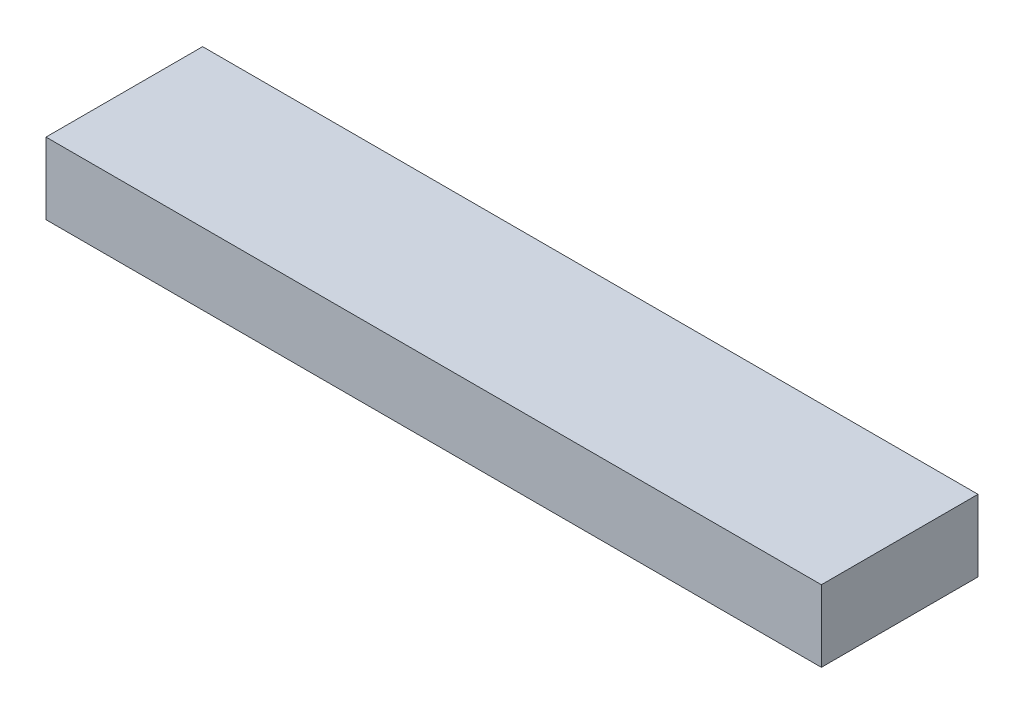
ISO-10303-21;
HEADER;
FILE_DESCRIPTION(('STEP AP214'),'2;1');
FILE_NAME('part.step','',(''),(''),'','','');
FILE_SCHEMA(('AUTOMOTIVE_DESIGN { 1 0 10303 214 1 1 1 1 }'));
ENDSEC;
DATA;
#1=APPLICATION_CONTEXT('core data for automotive mechanical design processes');
#2=APPLICATION_PROTOCOL_DEFINITION('international standard','automotive_design',2000,#1);
#3=PRODUCT_CONTEXT('',#1,'mechanical');
#4=PRODUCT('Part','Part','',(#3));
#5=PRODUCT_RELATED_PRODUCT_CATEGORY('part','',(#4));
#6=PRODUCT_DEFINITION_FORMATION('','',#4);
#7=PRODUCT_DEFINITION_CONTEXT('part definition',#1,'design');
#8=PRODUCT_DEFINITION('design','',#6,#7);
#9=PRODUCT_DEFINITION_SHAPE('','',#8);
#10=(LENGTH_UNIT() NAMED_UNIT(*) SI_UNIT(.MILLI.,.METRE.));
#11=(NAMED_UNIT(*) PLANE_ANGLE_UNIT() SI_UNIT($,.RADIAN.));
#12=(NAMED_UNIT(*) SI_UNIT($,.STERADIAN.) SOLID_ANGLE_UNIT());
#13=UNCERTAINTY_MEASURE_WITH_UNIT(LENGTH_MEASURE(1.E-05),#10,'distance_accuracy_value','');
#14=(GEOMETRIC_REPRESENTATION_CONTEXT(3) GLOBAL_UNCERTAINTY_ASSIGNED_CONTEXT((#13)) GLOBAL_UNIT_ASSIGNED_CONTEXT((#10,
#11,#12)) REPRESENTATION_CONTEXT('',''));
#15=CARTESIAN_POINT('',(0.,0.,0.));
#16=DIRECTION('',(0.,0.,1.));
#17=DIRECTION('',(1.,0.,0.));
#18=AXIS2_PLACEMENT_3D('',#15,#16,#17);
#19=CARTESIAN_POINT('',(-32.5,-3.00000000000001,13.1302768293175));
#20=DIRECTION('',(1.,0.,0.));
#21=DIRECTION('',(0.,0.,-1.));
#22=AXIS2_PLACEMENT_3D('',#19,#20,#21);
#23=PLANE('',#22);
#24=DIRECTION('',(0.,-1.,0.));
#25=VECTOR('',#24,1.);
#26=CARTESIAN_POINT('',(-32.5,-3.00000000000001,0.));
#27=LINE('',#26,#25);
#28=CARTESIAN_POINT('',(-32.5,2.99999999999999,0.));
#29=VERTEX_POINT('',#28);
#30=CARTESIAN_POINT('',(-32.5,-3.00000000000001,0.));
#31=VERTEX_POINT('',#30);
#32=EDGE_CURVE('E96',#29,#31,#27,.T.);
#33=ORIENTED_EDGE('',*,*,#32,.T.);
#34=DIRECTION('',(0.,0.,-1.));
#35=VECTOR('',#34,1.);
#36=CARTESIAN_POINT('',(-32.5,-3.00000000000001,13.1302768293175));
#37=LINE('',#36,#35);
#38=CARTESIAN_POINT('',(-32.5,-3.00000000000001,13.1302768293175));
#39=VERTEX_POINT('',#38);
#40=EDGE_CURVE('E11',#39,#31,#37,.T.);
#41=ORIENTED_EDGE('',*,*,#40,.F.);
#42=DIRECTION('',(0.,-1.,0.));
#43=VECTOR('',#42,1.);
#44=CARTESIAN_POINT('',(-32.5,-3.00000000000001,13.1302768293175));
#45=LINE('',#44,#43);
#46=CARTESIAN_POINT('',(-32.5,2.99999999999999,13.1302768293175));
#47=VERTEX_POINT('',#46);
#48=EDGE_CURVE('E84',#47,#39,#45,.T.);
#49=ORIENTED_EDGE('',*,*,#48,.F.);
#50=DIRECTION('',(0.,0.,-1.));
#51=VECTOR('',#50,1.);
#52=CARTESIAN_POINT('',(-32.5,2.99999999999999,13.1302768293175));
#53=LINE('',#52,#51);
#54=EDGE_CURVE('E92',#47,#29,#53,.T.);
#55=ORIENTED_EDGE('',*,*,#54,.T.);
#56=EDGE_LOOP('',(#33,#41,#49,#55));
#57=FACE_BOUND('',#56,.T.);
#58=ADVANCED_FACE('F33',(#57),#23,.F.);
#59=CARTESIAN_POINT('',(32.5,-3.,13.1302768293175));
#60=DIRECTION('',(0.,1.,0.));
#61=DIRECTION('',(-1.,0.,0.));
#62=AXIS2_PLACEMENT_3D('',#59,#60,#61);
#63=PLANE('',#62);
#64=DIRECTION('',(1.,0.,0.));
#65=VECTOR('',#64,1.);
#66=CARTESIAN_POINT('',(32.5,-3.,0.));
#67=LINE('',#66,#65);
#68=CARTESIAN_POINT('',(32.5,-3.,0.));
#69=VERTEX_POINT('',#68);
#70=EDGE_CURVE('E88',#31,#69,#67,.T.);
#71=ORIENTED_EDGE('',*,*,#70,.T.);
#72=DIRECTION('',(0.,0.,-1.));
#73=VECTOR('',#72,1.);
#74=CARTESIAN_POINT('',(32.5,-3.,13.1302768293175));
#75=LINE('',#74,#73);
#76=CARTESIAN_POINT('',(32.5,-3.,13.1302768293175));
#77=VERTEX_POINT('',#76);
#78=EDGE_CURVE('E41',#77,#69,#75,.T.);
#79=ORIENTED_EDGE('',*,*,#78,.F.);
#80=DIRECTION('',(1.,0.,0.));
#81=VECTOR('',#80,1.);
#82=CARTESIAN_POINT('',(32.5,-3.,13.1302768293175));
#83=LINE('',#82,#81);
#84=EDGE_CURVE('E79',#39,#77,#83,.T.);
#85=ORIENTED_EDGE('',*,*,#84,.F.);
#86=ORIENTED_EDGE('',*,*,#40,.T.);
#87=EDGE_LOOP('',(#71,#79,#85,#86));
#88=FACE_BOUND('',#87,.T.);
#89=ADVANCED_FACE('F87',(#88),#63,.F.);
#90=CARTESIAN_POINT('',(32.5,-3.,13.1302768293175));
#91=DIRECTION('',(-1.,0.,0.));
#92=DIRECTION('',(0.,0.,1.));
#93=AXIS2_PLACEMENT_3D('',#90,#91,#92);
#94=PLANE('',#93);
#95=DIRECTION('',(0.,1.,0.));
#96=VECTOR('',#95,1.);
#97=CARTESIAN_POINT('',(32.5,-3.,0.));
#98=LINE('',#97,#96);
#99=CARTESIAN_POINT('',(32.5,3.,0.));
#100=VERTEX_POINT('',#99);
#101=EDGE_CURVE('E66',#69,#100,#98,.T.);
#102=ORIENTED_EDGE('',*,*,#101,.T.);
#103=DIRECTION('',(0.,0.,-1.));
#104=VECTOR('',#103,1.);
#105=CARTESIAN_POINT('',(32.5,3.,13.1302768293175));
#106=LINE('',#105,#104);
#107=CARTESIAN_POINT('',(32.5,3.,13.1302768293175));
#108=VERTEX_POINT('',#107);
#109=EDGE_CURVE('E89',#108,#100,#106,.T.);
#110=ORIENTED_EDGE('',*,*,#109,.F.);
#111=DIRECTION('',(0.,1.,0.));
#112=VECTOR('',#111,1.);
#113=CARTESIAN_POINT('',(32.5,-3.,13.1302768293175));
#114=LINE('',#113,#112);
#115=EDGE_CURVE('E82',#77,#108,#114,.T.);
#116=ORIENTED_EDGE('',*,*,#115,.F.);
#117=ORIENTED_EDGE('',*,*,#78,.T.);
#118=EDGE_LOOP('',(#102,#110,#116,#117));
#119=FACE_BOUND('',#118,.T.);
#120=ADVANCED_FACE('F90',(#119),#94,.F.);
#121=CARTESIAN_POINT('',(32.5,3.,13.1302768293175));
#122=DIRECTION('',(0.,-1.,0.));
#123=DIRECTION('',(1.,0.,0.));
#124=AXIS2_PLACEMENT_3D('',#121,#122,#123);
#125=PLANE('',#124);
#126=DIRECTION('',(-1.,0.,0.));
#127=VECTOR('',#126,1.);
#128=CARTESIAN_POINT('',(32.5,3.,0.));
#129=LINE('',#128,#127);
#130=EDGE_CURVE('E72',#100,#29,#129,.T.);
#131=ORIENTED_EDGE('',*,*,#130,.T.);
#132=ORIENTED_EDGE('',*,*,#54,.F.);
#133=DIRECTION('',(-1.,0.,0.));
#134=VECTOR('',#133,1.);
#135=CARTESIAN_POINT('',(32.5,3.,13.1302768293175));
#136=LINE('',#135,#134);
#137=EDGE_CURVE('E49',#108,#47,#136,.T.);
#138=ORIENTED_EDGE('',*,*,#137,.F.);
#139=ORIENTED_EDGE('',*,*,#109,.T.);
#140=EDGE_LOOP('',(#131,#132,#138,#139));
#141=FACE_BOUND('',#140,.T.);
#142=ADVANCED_FACE('F103',(#141),#125,.F.);
#143=CARTESIAN_POINT('',(0.,0.,13.1302768293175));
#144=DIRECTION('',(0.,0.,1.));
#145=DIRECTION('',(1.,0.,0.));
#146=AXIS2_PLACEMENT_3D('',#143,#144,#145);
#147=PLANE('',#146);
#148=ORIENTED_EDGE('',*,*,#48,.T.);
#149=ORIENTED_EDGE('',*,*,#84,.T.);
#150=ORIENTED_EDGE('',*,*,#115,.T.);
#151=ORIENTED_EDGE('',*,*,#137,.T.);
#152=EDGE_LOOP('',(#148,#149,#150,#151));
#153=FACE_BOUND('',#152,.T.);
#154=ADVANCED_FACE('F80',(#153),#147,.T.);
#155=CARTESIAN_POINT('',(0.,0.,0.));
#156=DIRECTION('',(0.,0.,1.));
#157=DIRECTION('',(1.,0.,0.));
#158=AXIS2_PLACEMENT_3D('',#155,#156,#157);
#159=PLANE('',#158);
#160=ORIENTED_EDGE('',*,*,#32,.F.);
#161=ORIENTED_EDGE('',*,*,#130,.F.);
#162=ORIENTED_EDGE('',*,*,#101,.F.);
#163=ORIENTED_EDGE('',*,*,#70,.F.);
#164=EDGE_LOOP('',(#160,#161,#162,#163));
#165=FACE_BOUND('',#164,.T.);
#166=ADVANCED_FACE('F106',(#165),#159,.F.);
#167=CLOSED_SHELL('',(#58,#89,#120,#142,#154,#166));
#168=MANIFOLD_SOLID_BREP('B2',#167);
#169=ADVANCED_BREP_SHAPE_REPRESENTATION('',(#18,#168),#14);
#170=SHAPE_DEFINITION_REPRESENTATION(#9,#169);
ENDSEC;
END-ISO-10303-21;
